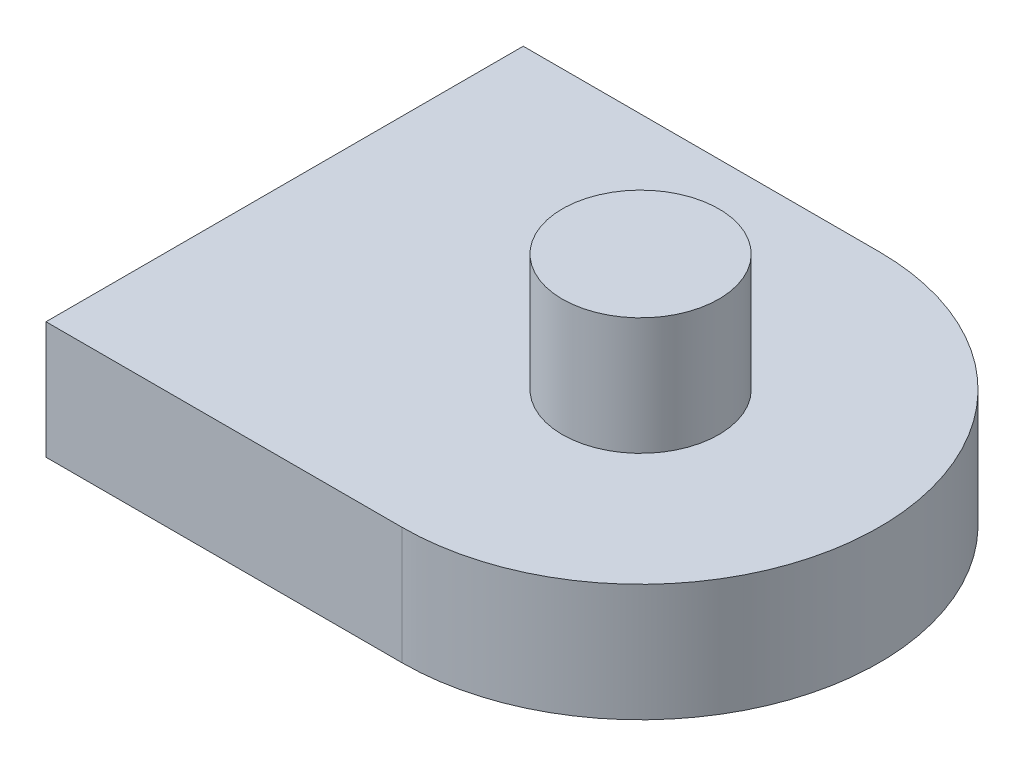
ISO-10303-21;
HEADER;
FILE_DESCRIPTION(('STEP AP214'),'2;1');
FILE_NAME('part.step','',(''),(''),'','','');
FILE_SCHEMA(('AUTOMOTIVE_DESIGN { 1 0 10303 214 1 1 1 1 }'));
ENDSEC;
DATA;
#1=APPLICATION_CONTEXT('core data for automotive mechanical design processes');
#2=APPLICATION_PROTOCOL_DEFINITION('international standard','automotive_design',2000,#1);
#3=PRODUCT_CONTEXT('',#1,'mechanical');
#4=PRODUCT('Part','Part','',(#3));
#5=PRODUCT_RELATED_PRODUCT_CATEGORY('part','',(#4));
#6=PRODUCT_DEFINITION_FORMATION('','',#4);
#7=PRODUCT_DEFINITION_CONTEXT('part definition',#1,'design');
#8=PRODUCT_DEFINITION('design','',#6,#7);
#9=PRODUCT_DEFINITION_SHAPE('','',#8);
#10=(LENGTH_UNIT() NAMED_UNIT(*) SI_UNIT(.MILLI.,.METRE.));
#11=(NAMED_UNIT(*) PLANE_ANGLE_UNIT() SI_UNIT($,.RADIAN.));
#12=(NAMED_UNIT(*) SI_UNIT($,.STERADIAN.) SOLID_ANGLE_UNIT());
#13=UNCERTAINTY_MEASURE_WITH_UNIT(LENGTH_MEASURE(1.E-05),#10,'distance_accuracy_value','');
#14=(GEOMETRIC_REPRESENTATION_CONTEXT(3) GLOBAL_UNCERTAINTY_ASSIGNED_CONTEXT((#13)) GLOBAL_UNIT_ASSIGNED_CONTEXT((#10,
#11,#12)) REPRESENTATION_CONTEXT('',''));
#15=CARTESIAN_POINT('',(0.,0.,0.));
#16=DIRECTION('',(0.,0.,1.));
#17=DIRECTION('',(1.,0.,0.));
#18=AXIS2_PLACEMENT_3D('',#15,#16,#17);
#19=CARTESIAN_POINT('',(-11.2368421052632,3.,-2.19385964912281));
#20=DIRECTION('',(0.,-1.,0.));
#21=DIRECTION('',(0.,0.,-1.));
#22=AXIS2_PLACEMENT_3D('',#19,#20,#21);
#23=CYLINDRICAL_SURFACE('',#22,6.1);
#24=CARTESIAN_POINT('',(-11.2368421052632,0.,-2.19385964912281));
#25=DIRECTION('',(0.,1.,0.));
#26=DIRECTION('',(0.,0.,1.));
#27=AXIS2_PLACEMENT_3D('',#24,#25,#26);
#28=CIRCLE('',#27,6.1);
#29=CARTESIAN_POINT('',(-11.2368421052632,0.,3.90614035087719));
#30=VERTEX_POINT('',#29);
#31=CARTESIAN_POINT('',(-11.2368421052632,0.,-8.29385964912281));
#32=VERTEX_POINT('',#31);
#33=EDGE_CURVE('E116',#30,#32,#28,.T.);
#34=ORIENTED_EDGE('',*,*,#33,.T.);
#35=DIRECTION('',(0.,-1.,0.));
#36=VECTOR('',#35,1.);
#37=CARTESIAN_POINT('',(-11.2368421052632,3.,-8.29385964912281));
#38=LINE('',#37,#36);
#39=CARTESIAN_POINT('',(-11.2368421052632,3.,-8.29385964912281));
#40=VERTEX_POINT('',#39);
#41=EDGE_CURVE('E48',#40,#32,#38,.T.);
#42=ORIENTED_EDGE('',*,*,#41,.F.);
#43=CARTESIAN_POINT('',(-11.2368421052632,3.,-2.19385964912281));
#44=DIRECTION('',(0.,1.,0.));
#45=DIRECTION('',(0.,0.,1.));
#46=AXIS2_PLACEMENT_3D('',#43,#44,#45);
#47=CIRCLE('',#46,6.1);
#48=CARTESIAN_POINT('',(-11.2368421052632,3.,3.90614035087719));
#49=VERTEX_POINT('',#48);
#50=EDGE_CURVE('E99',#49,#40,#47,.T.);
#51=ORIENTED_EDGE('',*,*,#50,.F.);
#52=DIRECTION('',(0.,-1.,0.));
#53=VECTOR('',#52,1.);
#54=CARTESIAN_POINT('',(-11.2368421052632,3.,3.90614035087719));
#55=LINE('',#54,#53);
#56=EDGE_CURVE('E112',#49,#30,#55,.T.);
#57=ORIENTED_EDGE('',*,*,#56,.T.);
#58=EDGE_LOOP('',(#34,#42,#51,#57));
#59=FACE_BOUND('',#58,.T.);
#60=ADVANCED_FACE('F45',(#59),#23,.T.);
#61=CARTESIAN_POINT('',(-20.3368421052632,3.,-8.29385964912281));
#62=DIRECTION('',(0.,0.,1.));
#63=DIRECTION('',(1.,0.,0.));
#64=AXIS2_PLACEMENT_3D('',#61,#62,#63);
#65=PLANE('',#64);
#66=DIRECTION('',(-1.,0.,0.));
#67=VECTOR('',#66,1.);
#68=CARTESIAN_POINT('',(-20.3368421052632,0.,-8.29385964912281));
#69=LINE('',#68,#67);
#70=CARTESIAN_POINT('',(-20.3368421052632,0.,-8.29385964912281));
#71=VERTEX_POINT('',#70);
#72=EDGE_CURVE('E105',#32,#71,#69,.T.);
#73=ORIENTED_EDGE('',*,*,#72,.T.);
#74=DIRECTION('',(0.,-1.,0.));
#75=VECTOR('',#74,1.);
#76=CARTESIAN_POINT('',(-20.3368421052632,3.,-8.29385964912281));
#77=LINE('',#76,#75);
#78=CARTESIAN_POINT('',(-20.3368421052632,3.,-8.29385964912281));
#79=VERTEX_POINT('',#78);
#80=EDGE_CURVE('E103',#79,#71,#77,.T.);
#81=ORIENTED_EDGE('',*,*,#80,.F.);
#82=DIRECTION('',(-1.,0.,0.));
#83=VECTOR('',#82,1.);
#84=CARTESIAN_POINT('',(-20.3368421052632,3.,-8.29385964912281));
#85=LINE('',#84,#83);
#86=EDGE_CURVE('E94',#40,#79,#85,.T.);
#87=ORIENTED_EDGE('',*,*,#86,.F.);
#88=ORIENTED_EDGE('',*,*,#41,.T.);
#89=EDGE_LOOP('',(#73,#81,#87,#88));
#90=FACE_BOUND('',#89,.T.);
#91=ADVANCED_FACE('F104',(#90),#65,.F.);
#92=CARTESIAN_POINT('',(-20.3368421052632,3.,-8.29385964912281));
#93=DIRECTION('',(1.,0.,0.));
#94=DIRECTION('',(0.,0.,-1.));
#95=AXIS2_PLACEMENT_3D('',#92,#93,#94);
#96=PLANE('',#95);
#97=DIRECTION('',(0.,0.,1.));
#98=VECTOR('',#97,1.);
#99=CARTESIAN_POINT('',(-20.3368421052632,0.,-8.29385964912281));
#100=LINE('',#99,#98);
#101=CARTESIAN_POINT('',(-20.3368421052632,0.,3.90614035087719));
#102=VERTEX_POINT('',#101);
#103=EDGE_CURVE('E80',#71,#102,#100,.T.);
#104=ORIENTED_EDGE('',*,*,#103,.T.);
#105=DIRECTION('',(0.,-1.,0.));
#106=VECTOR('',#105,1.);
#107=CARTESIAN_POINT('',(-20.3368421052632,3.,3.90614035087719));
#108=LINE('',#107,#106);
#109=CARTESIAN_POINT('',(-20.3368421052632,3.,3.90614035087719));
#110=VERTEX_POINT('',#109);
#111=EDGE_CURVE('E107',#110,#102,#108,.T.);
#112=ORIENTED_EDGE('',*,*,#111,.F.);
#113=DIRECTION('',(0.,0.,1.));
#114=VECTOR('',#113,1.);
#115=CARTESIAN_POINT('',(-20.3368421052632,3.,-8.29385964912281));
#116=LINE('',#115,#114);
#117=EDGE_CURVE('E97',#79,#110,#116,.T.);
#118=ORIENTED_EDGE('',*,*,#117,.F.);
#119=ORIENTED_EDGE('',*,*,#80,.T.);
#120=EDGE_LOOP('',(#104,#112,#118,#119));
#121=FACE_BOUND('',#120,.T.);
#122=ADVANCED_FACE('F108',(#121),#96,.F.);
#123=CARTESIAN_POINT('',(-20.3368421052632,3.,3.90614035087719));
#124=DIRECTION('',(0.,0.,-1.));
#125=DIRECTION('',(-1.,0.,0.));
#126=AXIS2_PLACEMENT_3D('',#123,#124,#125);
#127=PLANE('',#126);
#128=DIRECTION('',(1.,0.,0.));
#129=VECTOR('',#128,1.);
#130=CARTESIAN_POINT('',(-20.3368421052632,0.,3.90614035087719));
#131=LINE('',#130,#129);
#132=EDGE_CURVE('E86',#102,#30,#131,.T.);
#133=ORIENTED_EDGE('',*,*,#132,.T.);
#134=ORIENTED_EDGE('',*,*,#56,.F.);
#135=DIRECTION('',(1.,0.,0.));
#136=VECTOR('',#135,1.);
#137=CARTESIAN_POINT('',(-20.3368421052632,3.,3.90614035087719));
#138=LINE('',#137,#136);
#139=EDGE_CURVE('E63',#110,#49,#138,.T.);
#140=ORIENTED_EDGE('',*,*,#139,.F.);
#141=ORIENTED_EDGE('',*,*,#111,.T.);
#142=EDGE_LOOP('',(#133,#134,#140,#141));
#143=FACE_BOUND('',#142,.T.);
#144=ADVANCED_FACE('F130',(#143),#127,.F.);
#145=CARTESIAN_POINT('',(-11.2368421052632,3.,-2.19385964912281));
#146=DIRECTION('',(0.,1.,0.));
#147=DIRECTION('',(0.,0.,1.));
#148=AXIS2_PLACEMENT_3D('',#145,#146,#147);
#149=PLANE('',#148);
#150=CARTESIAN_POINT('',(-11.2368421052632,3.,-2.19385964912281));
#151=DIRECTION('',(0.,1.,0.));
#152=DIRECTION('',(0.,0.,1.));
#153=AXIS2_PLACEMENT_3D('',#150,#151,#152);
#154=CIRCLE('',#153,2.);
#155=CARTESIAN_POINT('',(-11.2368421052632,3.,-0.193859649122809));
#156=VERTEX_POINT('',#155);
#157=EDGE_CURVE('E11',#156,#156,#154,.T.);
#158=ORIENTED_EDGE('',*,*,#157,.F.);
#159=EDGE_LOOP('',(#158));
#160=FACE_BOUND('',#159,.T.);
#161=ORIENTED_EDGE('',*,*,#50,.T.);
#162=ORIENTED_EDGE('',*,*,#86,.T.);
#163=ORIENTED_EDGE('',*,*,#117,.T.);
#164=ORIENTED_EDGE('',*,*,#139,.T.);
#165=EDGE_LOOP('',(#161,#162,#163,#164));
#166=FACE_BOUND('',#165,.T.);
#167=ADVANCED_FACE('F95',(#160,#166),#149,.T.);
#168=CARTESIAN_POINT('',(-11.2368421052632,0.,-2.19385964912281));
#169=DIRECTION('',(0.,1.,0.));
#170=DIRECTION('',(0.,0.,1.));
#171=AXIS2_PLACEMENT_3D('',#168,#169,#170);
#172=PLANE('',#171);
#173=ORIENTED_EDGE('',*,*,#33,.F.);
#174=ORIENTED_EDGE('',*,*,#132,.F.);
#175=ORIENTED_EDGE('',*,*,#103,.F.);
#176=ORIENTED_EDGE('',*,*,#72,.F.);
#177=EDGE_LOOP('',(#173,#174,#175,#176));
#178=FACE_BOUND('',#177,.T.);
#179=ADVANCED_FACE('F133',(#178),#172,.F.);
#180=CARTESIAN_POINT('',(-11.2368421052632,6.,-2.19385964912281));
#181=DIRECTION('',(0.,-1.,0.));
#182=DIRECTION('',(0.,0.,-1.));
#183=AXIS2_PLACEMENT_3D('',#180,#181,#182);
#184=CYLINDRICAL_SURFACE('',#183,2.);
#185=CARTESIAN_POINT('',(-11.2368421052632,6.,-2.19385964912281));
#186=DIRECTION('',(0.,1.,0.));
#187=DIRECTION('',(0.,0.,1.));
#188=AXIS2_PLACEMENT_3D('',#185,#186,#187);
#189=CIRCLE('',#188,2.);
#190=CARTESIAN_POINT('',(-11.2368421052632,6.,-0.193859649122809));
#191=VERTEX_POINT('',#190);
#192=EDGE_CURVE('E120',#191,#191,#189,.T.);
#193=ORIENTED_EDGE('',*,*,#192,.F.);
#194=EDGE_LOOP('',(#193));
#195=FACE_BOUND('',#194,.T.);
#196=ORIENTED_EDGE('',*,*,#157,.T.);
#197=EDGE_LOOP('',(#196));
#198=FACE_BOUND('',#197,.T.);
#199=ADVANCED_FACE('F143',(#195,#198),#184,.T.);
#200=CARTESIAN_POINT('',(-11.2368421052632,6.,-2.19385964912281));
#201=DIRECTION('',(0.,1.,0.));
#202=DIRECTION('',(0.,0.,1.));
#203=AXIS2_PLACEMENT_3D('',#200,#201,#202);
#204=PLANE('',#203);
#205=ORIENTED_EDGE('',*,*,#192,.T.);
#206=EDGE_LOOP('',(#205));
#207=FACE_BOUND('',#206,.T.);
#208=ADVANCED_FACE('F141',(#207),#204,.T.);
#209=CLOSED_SHELL('',(#60,#91,#122,#144,#167,#179,#199,#208));
#210=MANIFOLD_SOLID_BREP('B2',#209);
#211=ADVANCED_BREP_SHAPE_REPRESENTATION('',(#18,#210),#14);
#212=SHAPE_DEFINITION_REPRESENTATION(#9,#211);
ENDSEC;
END-ISO-10303-21;
